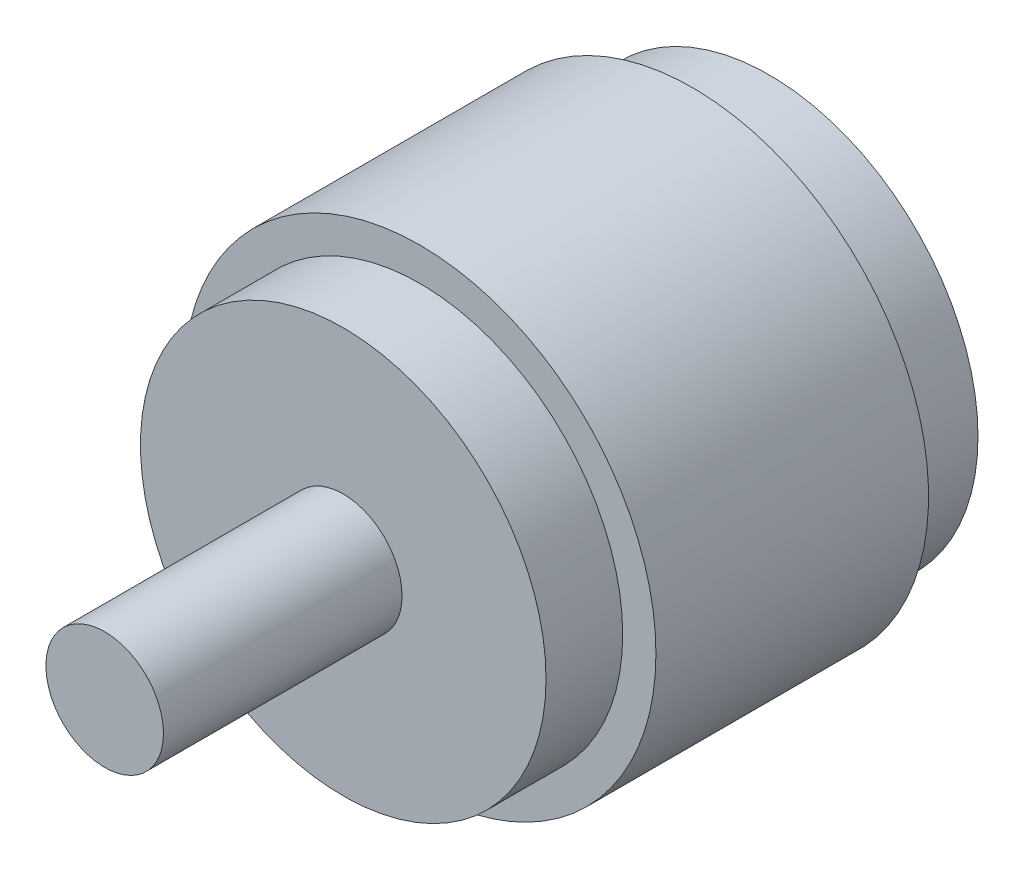
ISO-10303-21;
HEADER;
FILE_DESCRIPTION(('STEP AP214'),'2;1');
FILE_NAME('part.step','',(''),(''),'','','');
FILE_SCHEMA(('AUTOMOTIVE_DESIGN { 1 0 10303 214 1 1 1 1 }'));
ENDSEC;
DATA;
#1=APPLICATION_CONTEXT('core data for automotive mechanical design processes');
#2=APPLICATION_PROTOCOL_DEFINITION('international standard','automotive_design',2000,#1);
#3=PRODUCT_CONTEXT('',#1,'mechanical');
#4=PRODUCT('Part','Part','',(#3));
#5=PRODUCT_RELATED_PRODUCT_CATEGORY('part','',(#4));
#6=PRODUCT_DEFINITION_FORMATION('','',#4);
#7=PRODUCT_DEFINITION_CONTEXT('part definition',#1,'design');
#8=PRODUCT_DEFINITION('design','',#6,#7);
#9=PRODUCT_DEFINITION_SHAPE('','',#8);
#10=(LENGTH_UNIT() NAMED_UNIT(*) SI_UNIT(.MILLI.,.METRE.));
#11=(NAMED_UNIT(*) PLANE_ANGLE_UNIT() SI_UNIT($,.RADIAN.));
#12=(NAMED_UNIT(*) SI_UNIT($,.STERADIAN.) SOLID_ANGLE_UNIT());
#13=UNCERTAINTY_MEASURE_WITH_UNIT(LENGTH_MEASURE(1.E-05),#10,'distance_accuracy_value','');
#14=(GEOMETRIC_REPRESENTATION_CONTEXT(3) GLOBAL_UNCERTAINTY_ASSIGNED_CONTEXT((#13)) GLOBAL_UNIT_ASSIGNED_CONTEXT((#10,
#11,#12)) REPRESENTATION_CONTEXT('',''));
#15=CARTESIAN_POINT('',(0.,0.,0.));
#16=DIRECTION('',(0.,0.,1.));
#17=DIRECTION('',(1.,0.,0.));
#18=AXIS2_PLACEMENT_3D('',#15,#16,#17);
#19=CARTESIAN_POINT('',(0.,0.,25.));
#20=DIRECTION('',(0.,0.,1.));
#21=DIRECTION('',(1.,0.,0.));
#22=AXIS2_PLACEMENT_3D('',#19,#20,#21);
#23=PLANE('',#22);
#24=CARTESIAN_POINT('',(0.,0.,25.));
#25=DIRECTION('',(0.,0.,1.));
#26=DIRECTION('',(1.,0.,0.));
#27=AXIS2_PLACEMENT_3D('',#24,#25,#26);
#28=CIRCLE('',#27,11.9);
#29=CARTESIAN_POINT('',(11.9,0.,25.));
#30=VERTEX_POINT('',#29);
#31=EDGE_CURVE('E146',#30,#30,#28,.T.);
#32=ORIENTED_EDGE('',*,*,#31,.T.);
#33=EDGE_LOOP('',(#32));
#34=FACE_BOUND('',#33,.T.);
#35=CARTESIAN_POINT('',(0.,0.,25.));
#36=DIRECTION('',(0.,0.,1.));
#37=DIRECTION('',(1.,0.,0.));
#38=AXIS2_PLACEMENT_3D('',#35,#36,#37);
#39=CIRCLE('',#38,3.45);
#40=CARTESIAN_POINT('',(3.45,0.,25.));
#41=VERTEX_POINT('',#40);
#42=EDGE_CURVE('E132',#41,#41,#39,.T.);
#43=ORIENTED_EDGE('',*,*,#42,.F.);
#44=EDGE_LOOP('',(#43));
#45=FACE_BOUND('',#44,.T.);
#46=ADVANCED_FACE('F66',(#34,#45),#23,.T.);
#47=CARTESIAN_POINT('',(0.,0.,25.));
#48=DIRECTION('',(0.,0.,-1.));
#49=DIRECTION('',(-1.,0.,0.));
#50=AXIS2_PLACEMENT_3D('',#47,#48,#49);
#51=CYLINDRICAL_SURFACE('',#50,13.85);
#52=CARTESIAN_POINT('',(0.,0.,20.5));
#53=DIRECTION('',(0.,0.,1.));
#54=DIRECTION('',(1.,0.,0.));
#55=AXIS2_PLACEMENT_3D('',#52,#53,#54);
#56=CIRCLE('',#55,13.85);
#57=CARTESIAN_POINT('',(13.85,0.,20.5));
#58=VERTEX_POINT('',#57);
#59=EDGE_CURVE('E13',#58,#58,#56,.T.);
#60=ORIENTED_EDGE('',*,*,#59,.F.);
#61=EDGE_LOOP('',(#60));
#62=FACE_BOUND('',#61,.T.);
#63=CARTESIAN_POINT('',(0.,0.,4.5));
#64=DIRECTION('',(0.,0.,-1.));
#65=DIRECTION('',(-1.,0.,0.));
#66=AXIS2_PLACEMENT_3D('',#63,#64,#65);
#67=CIRCLE('',#66,13.85);
#68=CARTESIAN_POINT('',(-13.85,0.,4.5));
#69=VERTEX_POINT('',#68);
#70=EDGE_CURVE('E70',#69,#69,#67,.T.);
#71=ORIENTED_EDGE('',*,*,#70,.F.);
#72=EDGE_LOOP('',(#71));
#73=FACE_BOUND('',#72,.T.);
#74=ADVANCED_FACE('F68',(#62,#73),#51,.T.);
#75=CARTESIAN_POINT('',(0.,0.,20.5));
#76=DIRECTION('',(0.,0.,1.));
#77=DIRECTION('',(1.,0.,0.));
#78=AXIS2_PLACEMENT_3D('',#75,#76,#77);
#79=PLANE('',#78);
#80=CARTESIAN_POINT('',(0.,0.,20.5));
#81=DIRECTION('',(0.,0.,1.));
#82=DIRECTION('',(1.,0.,0.));
#83=AXIS2_PLACEMENT_3D('',#80,#81,#82);
#84=CIRCLE('',#83,11.9);
#85=CARTESIAN_POINT('',(11.9,0.,20.5));
#86=VERTEX_POINT('',#85);
#87=EDGE_CURVE('E75',#86,#86,#84,.T.);
#88=ORIENTED_EDGE('',*,*,#87,.F.);
#89=EDGE_LOOP('',(#88));
#90=FACE_BOUND('',#89,.T.);
#91=ORIENTED_EDGE('',*,*,#59,.T.);
#92=EDGE_LOOP('',(#91));
#93=FACE_BOUND('',#92,.T.);
#94=ADVANCED_FACE('F156',(#90,#93),#79,.T.);
#95=CARTESIAN_POINT('',(0.,0.,20.5));
#96=DIRECTION('',(0.,0.,1.));
#97=DIRECTION('',(1.,0.,0.));
#98=AXIS2_PLACEMENT_3D('',#95,#96,#97);
#99=CYLINDRICAL_SURFACE('',#98,11.9);
#100=ORIENTED_EDGE('',*,*,#87,.T.);
#101=EDGE_LOOP('',(#100));
#102=FACE_BOUND('',#101,.T.);
#103=ORIENTED_EDGE('',*,*,#31,.F.);
#104=EDGE_LOOP('',(#103));
#105=FACE_BOUND('',#104,.T.);
#106=ADVANCED_FACE('F162',(#102,#105),#99,.T.);
#107=CARTESIAN_POINT('',(0.,0.,4.5));
#108=DIRECTION('',(0.,0.,-1.));
#109=DIRECTION('',(-1.,0.,0.));
#110=AXIS2_PLACEMENT_3D('',#107,#108,#109);
#111=PLANE('',#110);
#112=CARTESIAN_POINT('',(0.,0.,4.5));
#113=DIRECTION('',(0.,0.,-1.));
#114=DIRECTION('',(-1.,0.,0.));
#115=AXIS2_PLACEMENT_3D('',#112,#113,#114);
#116=CIRCLE('',#115,12.25);
#117=CARTESIAN_POINT('',(-12.25,0.,4.5));
#118=VERTEX_POINT('',#117);
#119=EDGE_CURVE('E139',#118,#118,#116,.T.);
#120=ORIENTED_EDGE('',*,*,#119,.F.);
#121=EDGE_LOOP('',(#120));
#122=FACE_BOUND('',#121,.T.);
#123=ORIENTED_EDGE('',*,*,#70,.T.);
#124=EDGE_LOOP('',(#123));
#125=FACE_BOUND('',#124,.T.);
#126=ADVANCED_FACE('F153',(#122,#125),#111,.T.);
#127=CARTESIAN_POINT('',(0.,0.,4.5));
#128=DIRECTION('',(0.,0.,-1.));
#129=DIRECTION('',(-1.,0.,0.));
#130=AXIS2_PLACEMENT_3D('',#127,#128,#129);
#131=CYLINDRICAL_SURFACE('',#130,12.25);
#132=ORIENTED_EDGE('',*,*,#119,.T.);
#133=EDGE_LOOP('',(#132));
#134=FACE_BOUND('',#133,.T.);
#135=CARTESIAN_POINT('',(0.,0.,0.));
#136=DIRECTION('',(0.,0.,-1.));
#137=DIRECTION('',(-1.,0.,0.));
#138=AXIS2_PLACEMENT_3D('',#135,#136,#137);
#139=CIRCLE('',#138,12.25);
#140=CARTESIAN_POINT('',(-12.25,0.,0.));
#141=VERTEX_POINT('',#140);
#142=EDGE_CURVE('E136',#141,#141,#139,.T.);
#143=ORIENTED_EDGE('',*,*,#142,.F.);
#144=EDGE_LOOP('',(#143));
#145=FACE_BOUND('',#144,.T.);
#146=ADVANCED_FACE('F175',(#134,#145),#131,.T.);
#147=CARTESIAN_POINT('',(0.,0.,0.));
#148=DIRECTION('',(0.,0.,1.));
#149=DIRECTION('',(1.,0.,0.));
#150=AXIS2_PLACEMENT_3D('',#147,#148,#149);
#151=PLANE('',#150);
#152=CARTESIAN_POINT('',(6.125,5.30440559817969,0.));
#153=DIRECTION('',(0.,0.,-1.));
#154=DIRECTION('',(-1.,0.,0.));
#155=AXIS2_PLACEMENT_3D('',#152,#153,#154);
#156=CIRCLE('',#155,2.);
#157=CARTESIAN_POINT('',(4.125,5.30440559817969,0.));
#158=VERTEX_POINT('',#157);
#159=EDGE_CURVE('E105',#158,#158,#156,.T.);
#160=ORIENTED_EDGE('',*,*,#159,.F.);
#161=EDGE_LOOP('',(#160));
#162=FACE_BOUND('',#161,.T.);
#163=CARTESIAN_POINT('',(-6.125,5.30440559817969,0.));
#164=DIRECTION('',(0.,0.,-1.));
#165=DIRECTION('',(-1.,0.,0.));
#166=AXIS2_PLACEMENT_3D('',#163,#164,#165);
#167=CIRCLE('',#166,2.);
#168=CARTESIAN_POINT('',(-8.125,5.30440559817969,0.));
#169=VERTEX_POINT('',#168);
#170=EDGE_CURVE('E98',#169,#169,#167,.T.);
#171=ORIENTED_EDGE('',*,*,#170,.F.);
#172=EDGE_LOOP('',(#171));
#173=FACE_BOUND('',#172,.T.);
#174=CARTESIAN_POINT('',(-6.125,-5.30440559817969,0.));
#175=DIRECTION('',(0.,0.,-1.));
#176=DIRECTION('',(-1.,0.,0.));
#177=AXIS2_PLACEMENT_3D('',#174,#175,#176);
#178=CIRCLE('',#177,2.);
#179=CARTESIAN_POINT('',(-8.125,-5.30440559817969,0.));
#180=VERTEX_POINT('',#179);
#181=EDGE_CURVE('E114',#180,#180,#178,.T.);
#182=ORIENTED_EDGE('',*,*,#181,.F.);
#183=EDGE_LOOP('',(#182));
#184=FACE_BOUND('',#183,.T.);
#185=CARTESIAN_POINT('',(6.125,-5.30440559817969,0.));
#186=DIRECTION('',(0.,0.,-1.));
#187=DIRECTION('',(-1.,0.,0.));
#188=AXIS2_PLACEMENT_3D('',#185,#186,#187);
#189=CIRCLE('',#188,2.);
#190=CARTESIAN_POINT('',(4.125,-5.30440559817969,0.));
#191=VERTEX_POINT('',#190);
#192=EDGE_CURVE('E123',#191,#191,#189,.T.);
#193=ORIENTED_EDGE('',*,*,#192,.F.);
#194=EDGE_LOOP('',(#193));
#195=FACE_BOUND('',#194,.T.);
#196=ORIENTED_EDGE('',*,*,#142,.T.);
#197=EDGE_LOOP('',(#196));
#198=FACE_BOUND('',#197,.T.);
#199=ADVANCED_FACE('F172',(#162,#173,#184,#195,#198),#151,.F.);
#200=CARTESIAN_POINT('',(0.,0.,39.));
#201=DIRECTION('',(0.,0.,-1.));
#202=DIRECTION('',(-1.,0.,0.));
#203=AXIS2_PLACEMENT_3D('',#200,#201,#202);
#204=CYLINDRICAL_SURFACE('',#203,3.45);
#205=CARTESIAN_POINT('',(0.,0.,39.));
#206=DIRECTION('',(0.,0.,1.));
#207=DIRECTION('',(1.,0.,0.));
#208=AXIS2_PLACEMENT_3D('',#205,#206,#207);
#209=CIRCLE('',#208,3.45);
#210=CARTESIAN_POINT('',(3.45,0.,39.));
#211=VERTEX_POINT('',#210);
#212=EDGE_CURVE('E133',#211,#211,#209,.T.);
#213=ORIENTED_EDGE('',*,*,#212,.F.);
#214=EDGE_LOOP('',(#213));
#215=FACE_BOUND('',#214,.T.);
#216=ORIENTED_EDGE('',*,*,#42,.T.);
#217=EDGE_LOOP('',(#216));
#218=FACE_BOUND('',#217,.T.);
#219=ADVANCED_FACE('F174',(#215,#218),#204,.T.);
#220=CARTESIAN_POINT('',(0.,0.,39.));
#221=DIRECTION('',(0.,0.,1.));
#222=DIRECTION('',(1.,0.,0.));
#223=AXIS2_PLACEMENT_3D('',#220,#221,#222);
#224=PLANE('',#223);
#225=ORIENTED_EDGE('',*,*,#212,.T.);
#226=EDGE_LOOP('',(#225));
#227=FACE_BOUND('',#226,.T.);
#228=ADVANCED_FACE('F181',(#227),#224,.T.);
#229=CARTESIAN_POINT('',(6.125,-5.30440559817969,5.));
#230=DIRECTION('',(0.,0.,-1.));
#231=DIRECTION('',(-1.,0.,0.));
#232=AXIS2_PLACEMENT_3D('',#229,#230,#231);
#233=CONICAL_SURFACE('',#232,1.7,1.02974425867665);
#234=CARTESIAN_POINT('',(6.125,-5.30440559817969,6.02146305234685));
#235=VERTEX_POINT('',#234);
#236=VERTEX_LOOP('',#235);
#237=FACE_BOUND('',#236,.T.);
#238=CARTESIAN_POINT('',(6.125,-5.30440559817969,5.));
#239=DIRECTION('',(0.,0.,-1.));
#240=DIRECTION('',(-1.,0.,0.));
#241=AXIS2_PLACEMENT_3D('',#238,#239,#240);
#242=CIRCLE('',#241,1.7);
#243=CARTESIAN_POINT('',(4.425,-5.30440559817969,5.));
#244=VERTEX_POINT('',#243);
#245=EDGE_CURVE('E129',#244,#244,#242,.T.);
#246=ORIENTED_EDGE('',*,*,#245,.T.);
#247=EDGE_LOOP('',(#246));
#248=FACE_BOUND('',#247,.T.);
#249=ADVANCED_FACE('F210',(#237,#248),#233,.F.);
#250=CARTESIAN_POINT('',(6.125,-5.30440559817969,0.));
#251=DIRECTION('',(0.,0.,-1.));
#252=DIRECTION('',(-1.,0.,0.));
#253=AXIS2_PLACEMENT_3D('',#250,#251,#252);
#254=CYLINDRICAL_SURFACE('',#253,1.7);
#255=ORIENTED_EDGE('',*,*,#245,.F.);
#256=EDGE_LOOP('',(#255));
#257=FACE_BOUND('',#256,.T.);
#258=CARTESIAN_POINT('',(6.125,-5.30440559817969,0.3));
#259=DIRECTION('',(0.,0.,-1.));
#260=DIRECTION('',(-1.,0.,0.));
#261=AXIS2_PLACEMENT_3D('',#258,#259,#260);
#262=CIRCLE('',#261,1.7);
#263=CARTESIAN_POINT('',(4.425,-5.30440559817969,0.3));
#264=VERTEX_POINT('',#263);
#265=EDGE_CURVE('E126',#264,#264,#262,.T.);
#266=ORIENTED_EDGE('',*,*,#265,.T.);
#267=EDGE_LOOP('',(#266));
#268=FACE_BOUND('',#267,.T.);
#269=ADVANCED_FACE('F201',(#257,#268),#254,.F.);
#270=CARTESIAN_POINT('',(6.125,-5.30440559817969,0.));
#271=DIRECTION('',(0.,0.,-1.));
#272=DIRECTION('',(-1.,0.,0.));
#273=AXIS2_PLACEMENT_3D('',#270,#271,#272);
#274=CONICAL_SURFACE('',#273,2.,0.785398163397448);
#275=ORIENTED_EDGE('',*,*,#265,.F.);
#276=EDGE_LOOP('',(#275));
#277=FACE_BOUND('',#276,.T.);
#278=ORIENTED_EDGE('',*,*,#192,.T.);
#279=EDGE_LOOP('',(#278));
#280=FACE_BOUND('',#279,.T.);
#281=ADVANCED_FACE('F198',(#277,#280),#274,.F.);
#282=CARTESIAN_POINT('',(-6.125,-5.30440559817969,5.));
#283=DIRECTION('',(0.,0.,-1.));
#284=DIRECTION('',(-1.,0.,0.));
#285=AXIS2_PLACEMENT_3D('',#282,#283,#284);
#286=CONICAL_SURFACE('',#285,1.7,1.02974425867665);
#287=CARTESIAN_POINT('',(-6.125,-5.30440559817969,6.02146305234685));
#288=VERTEX_POINT('',#287);
#289=VERTEX_LOOP('',#288);
#290=FACE_BOUND('',#289,.T.);
#291=CARTESIAN_POINT('',(-6.125,-5.30440559817969,5.));
#292=DIRECTION('',(0.,0.,-1.));
#293=DIRECTION('',(-1.,0.,0.));
#294=AXIS2_PLACEMENT_3D('',#291,#292,#293);
#295=CIRCLE('',#294,1.7);
#296=CARTESIAN_POINT('',(-7.825,-5.30440559817969,5.));
#297=VERTEX_POINT('',#296);
#298=EDGE_CURVE('E120',#297,#297,#295,.T.);
#299=ORIENTED_EDGE('',*,*,#298,.T.);
#300=EDGE_LOOP('',(#299));
#301=FACE_BOUND('',#300,.T.);
#302=ADVANCED_FACE('F200',(#290,#301),#286,.F.);
#303=CARTESIAN_POINT('',(-6.125,-5.30440559817969,0.));
#304=DIRECTION('',(0.,0.,-1.));
#305=DIRECTION('',(-1.,0.,0.));
#306=AXIS2_PLACEMENT_3D('',#303,#304,#305);
#307=CYLINDRICAL_SURFACE('',#306,1.7);
#308=ORIENTED_EDGE('',*,*,#298,.F.);
#309=EDGE_LOOP('',(#308));
#310=FACE_BOUND('',#309,.T.);
#311=CARTESIAN_POINT('',(-6.125,-5.30440559817969,0.3));
#312=DIRECTION('',(0.,0.,-1.));
#313=DIRECTION('',(-1.,0.,0.));
#314=AXIS2_PLACEMENT_3D('',#311,#312,#313);
#315=CIRCLE('',#314,1.7);
#316=CARTESIAN_POINT('',(-7.825,-5.30440559817969,0.3));
#317=VERTEX_POINT('',#316);
#318=EDGE_CURVE('E117',#317,#317,#315,.T.);
#319=ORIENTED_EDGE('',*,*,#318,.T.);
#320=EDGE_LOOP('',(#319));
#321=FACE_BOUND('',#320,.T.);
#322=ADVANCED_FACE('F208',(#310,#321),#307,.F.);
#323=CARTESIAN_POINT('',(-6.125,-5.30440559817969,0.));
#324=DIRECTION('',(0.,0.,-1.));
#325=DIRECTION('',(-1.,0.,0.));
#326=AXIS2_PLACEMENT_3D('',#323,#324,#325);
#327=CONICAL_SURFACE('',#326,2.,0.785398163397448);
#328=ORIENTED_EDGE('',*,*,#318,.F.);
#329=EDGE_LOOP('',(#328));
#330=FACE_BOUND('',#329,.T.);
#331=ORIENTED_EDGE('',*,*,#181,.T.);
#332=EDGE_LOOP('',(#331));
#333=FACE_BOUND('',#332,.T.);
#334=ADVANCED_FACE('F292',(#330,#333),#327,.F.);
#335=CARTESIAN_POINT('',(-6.125,5.30440559817969,5.));
#336=DIRECTION('',(0.,0.,-1.));
#337=DIRECTION('',(-1.,0.,0.));
#338=AXIS2_PLACEMENT_3D('',#335,#336,#337);
#339=CONICAL_SURFACE('',#338,1.7,1.02974425867665);
#340=CARTESIAN_POINT('',(-6.125,5.30440559817969,6.02146305234685));
#341=VERTEX_POINT('',#340);
#342=VERTEX_LOOP('',#341);
#343=FACE_BOUND('',#342,.T.);
#344=CARTESIAN_POINT('',(-6.125,5.30440559817969,5.));
#345=DIRECTION('',(0.,0.,-1.));
#346=DIRECTION('',(-1.,0.,0.));
#347=AXIS2_PLACEMENT_3D('',#344,#345,#346);
#348=CIRCLE('',#347,1.7);
#349=CARTESIAN_POINT('',(-7.825,5.30440559817969,5.));
#350=VERTEX_POINT('',#349);
#351=EDGE_CURVE('E111',#350,#350,#348,.T.);
#352=ORIENTED_EDGE('',*,*,#351,.T.);
#353=EDGE_LOOP('',(#352));
#354=FACE_BOUND('',#353,.T.);
#355=ADVANCED_FACE('F301',(#343,#354),#339,.F.);
#356=CARTESIAN_POINT('',(-6.125,5.30440559817969,0.));
#357=DIRECTION('',(0.,0.,-1.));
#358=DIRECTION('',(-1.,0.,0.));
#359=AXIS2_PLACEMENT_3D('',#356,#357,#358);
#360=CYLINDRICAL_SURFACE('',#359,1.7);
#361=ORIENTED_EDGE('',*,*,#351,.F.);
#362=EDGE_LOOP('',(#361));
#363=FACE_BOUND('',#362,.T.);
#364=CARTESIAN_POINT('',(-6.125,5.30440559817969,0.3));
#365=DIRECTION('',(0.,0.,-1.));
#366=DIRECTION('',(-1.,0.,0.));
#367=AXIS2_PLACEMENT_3D('',#364,#365,#366);
#368=CIRCLE('',#367,1.7);
#369=CARTESIAN_POINT('',(-7.825,5.30440559817969,0.3));
#370=VERTEX_POINT('',#369);
#371=EDGE_CURVE('E102',#370,#370,#368,.T.);
#372=ORIENTED_EDGE('',*,*,#371,.T.);
#373=EDGE_LOOP('',(#372));
#374=FACE_BOUND('',#373,.T.);
#375=ADVANCED_FACE('F311',(#363,#374),#360,.F.);
#376=CARTESIAN_POINT('',(-6.125,5.30440559817969,0.));
#377=DIRECTION('',(0.,0.,-1.));
#378=DIRECTION('',(-1.,0.,0.));
#379=AXIS2_PLACEMENT_3D('',#376,#377,#378);
#380=CONICAL_SURFACE('',#379,2.,0.785398163397448);
#381=ORIENTED_EDGE('',*,*,#371,.F.);
#382=EDGE_LOOP('',(#381));
#383=FACE_BOUND('',#382,.T.);
#384=ORIENTED_EDGE('',*,*,#170,.T.);
#385=EDGE_LOOP('',(#384));
#386=FACE_BOUND('',#385,.T.);
#387=ADVANCED_FACE('F92',(#383,#386),#380,.F.);
#388=CARTESIAN_POINT('',(6.125,5.30440559817969,5.));
#389=DIRECTION('',(0.,0.,-1.));
#390=DIRECTION('',(-1.,0.,0.));
#391=AXIS2_PLACEMENT_3D('',#388,#389,#390);
#392=CONICAL_SURFACE('',#391,1.7,1.02974425867665);
#393=CARTESIAN_POINT('',(6.125,5.30440559817969,6.02146305234685));
#394=VERTEX_POINT('',#393);
#395=VERTEX_LOOP('',#394);
#396=FACE_BOUND('',#395,.T.);
#397=CARTESIAN_POINT('',(6.125,5.30440559817969,5.));
#398=DIRECTION('',(0.,0.,-1.));
#399=DIRECTION('',(-1.,0.,0.));
#400=AXIS2_PLACEMENT_3D('',#397,#398,#399);
#401=CIRCLE('',#400,1.7);
#402=CARTESIAN_POINT('',(4.425,5.30440559817969,5.));
#403=VERTEX_POINT('',#402);
#404=EDGE_CURVE('E96',#403,#403,#401,.T.);
#405=ORIENTED_EDGE('',*,*,#404,.T.);
#406=EDGE_LOOP('',(#405));
#407=FACE_BOUND('',#406,.T.);
#408=ADVANCED_FACE('F88',(#396,#407),#392,.F.);
#409=CARTESIAN_POINT('',(6.125,5.30440559817969,0.));
#410=DIRECTION('',(0.,0.,-1.));
#411=DIRECTION('',(-1.,0.,0.));
#412=AXIS2_PLACEMENT_3D('',#409,#410,#411);
#413=CYLINDRICAL_SURFACE('',#412,1.7);
#414=ORIENTED_EDGE('',*,*,#404,.F.);
#415=EDGE_LOOP('',(#414));
#416=FACE_BOUND('',#415,.T.);
#417=CARTESIAN_POINT('',(6.125,5.30440559817969,0.3));
#418=DIRECTION('',(0.,0.,-1.));
#419=DIRECTION('',(-1.,0.,0.));
#420=AXIS2_PLACEMENT_3D('',#417,#418,#419);
#421=CIRCLE('',#420,1.7);
#422=CARTESIAN_POINT('',(4.425,5.30440559817969,0.3));
#423=VERTEX_POINT('',#422);
#424=EDGE_CURVE('E99',#423,#423,#421,.T.);
#425=ORIENTED_EDGE('',*,*,#424,.T.);
#426=EDGE_LOOP('',(#425));
#427=FACE_BOUND('',#426,.T.);
#428=ADVANCED_FACE('F91',(#416,#427),#413,.F.);
#429=CARTESIAN_POINT('',(6.125,5.30440559817969,0.));
#430=DIRECTION('',(0.,0.,-1.));
#431=DIRECTION('',(-1.,0.,0.));
#432=AXIS2_PLACEMENT_3D('',#429,#430,#431);
#433=CONICAL_SURFACE('',#432,2.,0.785398163397448);
#434=ORIENTED_EDGE('',*,*,#424,.F.);
#435=EDGE_LOOP('',(#434));
#436=FACE_BOUND('',#435,.T.);
#437=ORIENTED_EDGE('',*,*,#159,.T.);
#438=EDGE_LOOP('',(#437));
#439=FACE_BOUND('',#438,.T.);
#440=ADVANCED_FACE('F345',(#436,#439),#433,.F.);
#441=CLOSED_SHELL('',(#46,#74,#94,#106,#126,#146,#199,#219,#228,#249,#269,#281,#302,#322,#334,
#355,#375,#387,#408,#428,#440));
#442=MANIFOLD_SOLID_BREP('B2',#441);
#443=ADVANCED_BREP_SHAPE_REPRESENTATION('',(#18,#442),#14);
#444=SHAPE_DEFINITION_REPRESENTATION(#9,#443);
ENDSEC;
END-ISO-10303-21;
